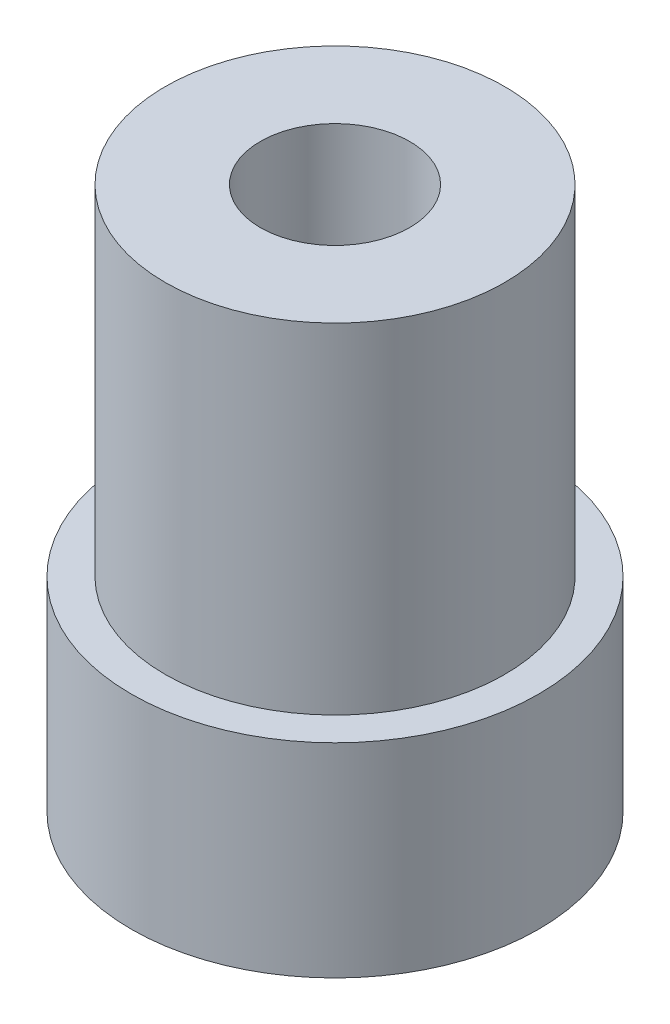
ISO-10303-21;
HEADER;
FILE_DESCRIPTION(('STEP AP214'),'2;1');
FILE_NAME('part.step','',(''),(''),'','','');
FILE_SCHEMA(('AUTOMOTIVE_DESIGN { 1 0 10303 214 1 1 1 1 }'));
ENDSEC;
DATA;
#1=APPLICATION_CONTEXT('core data for automotive mechanical design processes');
#2=APPLICATION_PROTOCOL_DEFINITION('international standard','automotive_design',2000,#1);
#3=PRODUCT_CONTEXT('',#1,'mechanical');
#4=PRODUCT('Part','Part','',(#3));
#5=PRODUCT_RELATED_PRODUCT_CATEGORY('part','',(#4));
#6=PRODUCT_DEFINITION_FORMATION('','',#4);
#7=PRODUCT_DEFINITION_CONTEXT('part definition',#1,'design');
#8=PRODUCT_DEFINITION('design','',#6,#7);
#9=PRODUCT_DEFINITION_SHAPE('','',#8);
#10=(LENGTH_UNIT() NAMED_UNIT(*) SI_UNIT(.MILLI.,.METRE.));
#11=(NAMED_UNIT(*) PLANE_ANGLE_UNIT() SI_UNIT($,.RADIAN.));
#12=(NAMED_UNIT(*) SI_UNIT($,.STERADIAN.) SOLID_ANGLE_UNIT());
#13=UNCERTAINTY_MEASURE_WITH_UNIT(LENGTH_MEASURE(1.E-05),#10,'distance_accuracy_value','');
#14=(GEOMETRIC_REPRESENTATION_CONTEXT(3) GLOBAL_UNCERTAINTY_ASSIGNED_CONTEXT((#13)) GLOBAL_UNIT_ASSIGNED_CONTEXT((#10,
#11,#12)) REPRESENTATION_CONTEXT('',''));
#15=CARTESIAN_POINT('',(0.,0.,0.));
#16=DIRECTION('',(0.,0.,1.));
#17=DIRECTION('',(1.,0.,0.));
#18=AXIS2_PLACEMENT_3D('',#15,#16,#17);
#19=CARTESIAN_POINT('',(0.,0.,0.));
#20=DIRECTION('',(0.,1.,0.));
#21=DIRECTION('',(0.,0.,1.));
#22=AXIS2_PLACEMENT_3D('',#19,#20,#21);
#23=PLANE('',#22);
#24=CARTESIAN_POINT('',(0.,0.,0.));
#25=DIRECTION('',(0.,1.,0.));
#26=DIRECTION('',(0.,0.,1.));
#27=AXIS2_PLACEMENT_3D('',#24,#25,#26);
#28=CIRCLE('',#27,1.1);
#29=CARTESIAN_POINT('',(0.,0.,1.1));
#30=VERTEX_POINT('',#29);
#31=EDGE_CURVE('E54',#30,#30,#28,.T.);
#32=ORIENTED_EDGE('',*,*,#31,.T.);
#33=EDGE_LOOP('',(#32));
#34=FACE_BOUND('',#33,.T.);
#35=CARTESIAN_POINT('',(0.,0.,0.));
#36=DIRECTION('',(0.,1.,0.));
#37=DIRECTION('',(0.,0.,1.));
#38=AXIS2_PLACEMENT_3D('',#35,#36,#37);
#39=CIRCLE('',#38,3.);
#40=CARTESIAN_POINT('',(0.,0.,3.));
#41=VERTEX_POINT('',#40);
#42=EDGE_CURVE('E10',#41,#41,#39,.T.);
#43=ORIENTED_EDGE('',*,*,#42,.F.);
#44=EDGE_LOOP('',(#43));
#45=FACE_BOUND('',#44,.T.);
#46=ADVANCED_FACE('F35',(#34,#45),#23,.F.);
#47=CARTESIAN_POINT('',(0.,8.,0.));
#48=DIRECTION('',(0.,1.,0.));
#49=DIRECTION('',(0.,0.,1.));
#50=AXIS2_PLACEMENT_3D('',#47,#48,#49);
#51=CYLINDRICAL_SURFACE('',#50,3.);
#52=CARTESIAN_POINT('',(0.,3.,0.));
#53=DIRECTION('',(0.,1.,0.));
#54=DIRECTION('',(0.,0.,1.));
#55=AXIS2_PLACEMENT_3D('',#52,#53,#54);
#56=CIRCLE('',#55,3.);
#57=CARTESIAN_POINT('',(0.,3.,3.));
#58=VERTEX_POINT('',#57);
#59=EDGE_CURVE('E41',#58,#58,#56,.T.);
#60=ORIENTED_EDGE('',*,*,#59,.F.);
#61=EDGE_LOOP('',(#60));
#62=FACE_BOUND('',#61,.T.);
#63=ORIENTED_EDGE('',*,*,#42,.T.);
#64=EDGE_LOOP('',(#63));
#65=FACE_BOUND('',#64,.T.);
#66=ADVANCED_FACE('F77',(#62,#65),#51,.T.);
#67=CARTESIAN_POINT('',(0.,3.,-3.));
#68=DIRECTION('',(0.,-1.,0.));
#69=DIRECTION('',(0.,0.,-1.));
#70=AXIS2_PLACEMENT_3D('',#67,#68,#69);
#71=PLANE('',#70);
#72=CARTESIAN_POINT('',(0.,3.,0.));
#73=DIRECTION('',(0.,1.,0.));
#74=DIRECTION('',(0.,0.,1.));
#75=AXIS2_PLACEMENT_3D('',#72,#73,#74);
#76=CIRCLE('',#75,2.5);
#77=CARTESIAN_POINT('',(0.,3.,2.5));
#78=VERTEX_POINT('',#77);
#79=EDGE_CURVE('E45',#78,#78,#76,.T.);
#80=ORIENTED_EDGE('',*,*,#79,.F.);
#81=EDGE_LOOP('',(#80));
#82=FACE_BOUND('',#81,.T.);
#83=ORIENTED_EDGE('',*,*,#59,.T.);
#84=EDGE_LOOP('',(#83));
#85=FACE_BOUND('',#84,.T.);
#86=ADVANCED_FACE('F72',(#82,#85),#71,.F.);
#87=CARTESIAN_POINT('',(0.,8.,0.));
#88=DIRECTION('',(0.,1.,0.));
#89=DIRECTION('',(0.,0.,1.));
#90=AXIS2_PLACEMENT_3D('',#87,#88,#89);
#91=CYLINDRICAL_SURFACE('',#90,2.5);
#92=CARTESIAN_POINT('',(0.,8.,0.));
#93=DIRECTION('',(0.,1.,0.));
#94=DIRECTION('',(0.,0.,1.));
#95=AXIS2_PLACEMENT_3D('',#92,#93,#94);
#96=CIRCLE('',#95,2.5);
#97=CARTESIAN_POINT('',(0.,8.,2.5));
#98=VERTEX_POINT('',#97);
#99=EDGE_CURVE('E49',#98,#98,#96,.T.);
#100=ORIENTED_EDGE('',*,*,#99,.F.);
#101=EDGE_LOOP('',(#100));
#102=FACE_BOUND('',#101,.T.);
#103=ORIENTED_EDGE('',*,*,#79,.T.);
#104=EDGE_LOOP('',(#103));
#105=FACE_BOUND('',#104,.T.);
#106=ADVANCED_FACE('F66',(#102,#105),#91,.T.);
#107=CARTESIAN_POINT('',(0.,8.,-2.5));
#108=DIRECTION('',(0.,-1.,0.));
#109=DIRECTION('',(0.,0.,-1.));
#110=AXIS2_PLACEMENT_3D('',#107,#108,#109);
#111=PLANE('',#110);
#112=CARTESIAN_POINT('',(0.,8.,0.));
#113=DIRECTION('',(0.,1.,0.));
#114=DIRECTION('',(0.,0.,1.));
#115=AXIS2_PLACEMENT_3D('',#112,#113,#114);
#116=CIRCLE('',#115,1.1);
#117=CARTESIAN_POINT('',(0.,8.,1.1));
#118=VERTEX_POINT('',#117);
#119=EDGE_CURVE('E57',#118,#118,#116,.T.);
#120=ORIENTED_EDGE('',*,*,#119,.F.);
#121=EDGE_LOOP('',(#120));
#122=FACE_BOUND('',#121,.T.);
#123=ORIENTED_EDGE('',*,*,#99,.T.);
#124=EDGE_LOOP('',(#123));
#125=FACE_BOUND('',#124,.T.);
#126=ADVANCED_FACE('F63',(#122,#125),#111,.F.);
#127=CARTESIAN_POINT('',(0.,8.,0.));
#128=DIRECTION('',(0.,1.,0.));
#129=DIRECTION('',(0.,0.,1.));
#130=AXIS2_PLACEMENT_3D('',#127,#128,#129);
#131=CYLINDRICAL_SURFACE('',#130,1.1);
#132=ORIENTED_EDGE('',*,*,#31,.F.);
#133=EDGE_LOOP('',(#132));
#134=FACE_BOUND('',#133,.T.);
#135=ORIENTED_EDGE('',*,*,#119,.T.);
#136=EDGE_LOOP('',(#135));
#137=FACE_BOUND('',#136,.T.);
#138=ADVANCED_FACE('F61',(#134,#137),#131,.F.);
#139=CLOSED_SHELL('',(#46,#66,#86,#106,#126,#138));
#140=MANIFOLD_SOLID_BREP('B2',#139);
#141=ADVANCED_BREP_SHAPE_REPRESENTATION('',(#18,#140),#14);
#142=SHAPE_DEFINITION_REPRESENTATION(#9,#141);
ENDSEC;
END-ISO-10303-21;
